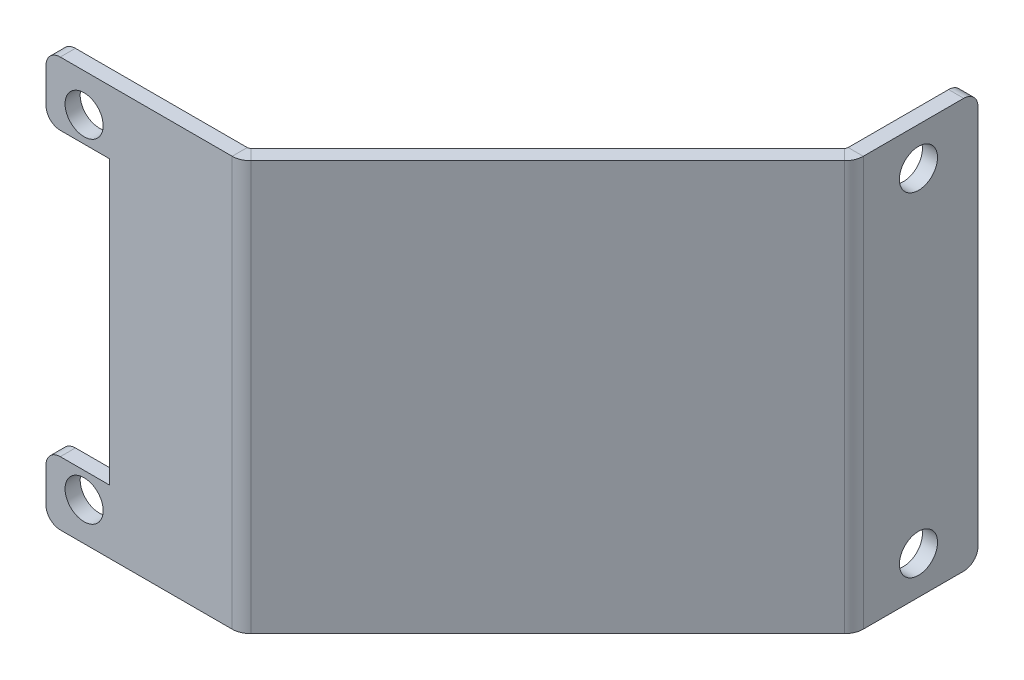
ISO-10303-21;
HEADER;
FILE_DESCRIPTION(('STEP AP214'),'2;1');
FILE_NAME('part.step','',(''),(''),'','','');
FILE_SCHEMA(('AUTOMOTIVE_DESIGN { 1 0 10303 214 1 1 1 1 }'));
ENDSEC;
DATA;
#1=APPLICATION_CONTEXT('core data for automotive mechanical design processes');
#2=APPLICATION_PROTOCOL_DEFINITION('international standard','automotive_design',2000,#1);
#3=PRODUCT_CONTEXT('',#1,'mechanical');
#4=PRODUCT('Part','Part','',(#3));
#5=PRODUCT_RELATED_PRODUCT_CATEGORY('part','',(#4));
#6=PRODUCT_DEFINITION_FORMATION('','',#4);
#7=PRODUCT_DEFINITION_CONTEXT('part definition',#1,'design');
#8=PRODUCT_DEFINITION('design','',#6,#7);
#9=PRODUCT_DEFINITION_SHAPE('','',#8);
#10=(LENGTH_UNIT() NAMED_UNIT(*) SI_UNIT(.MILLI.,.METRE.));
#11=(NAMED_UNIT(*) PLANE_ANGLE_UNIT() SI_UNIT($,.RADIAN.));
#12=(NAMED_UNIT(*) SI_UNIT($,.STERADIAN.) SOLID_ANGLE_UNIT());
#13=UNCERTAINTY_MEASURE_WITH_UNIT(LENGTH_MEASURE(1.E-05),#10,'distance_accuracy_value','');
#14=(GEOMETRIC_REPRESENTATION_CONTEXT(3) GLOBAL_UNCERTAINTY_ASSIGNED_CONTEXT((#13)) GLOBAL_UNIT_ASSIGNED_CONTEXT((#10,
#11,#12)) REPRESENTATION_CONTEXT('',''));
#15=CARTESIAN_POINT('',(0.,0.,0.));
#16=DIRECTION('',(0.,0.,1.));
#17=DIRECTION('',(1.,0.,0.));
#18=AXIS2_PLACEMENT_3D('',#15,#16,#17);
#19=CARTESIAN_POINT('',(-25.1524992584834,0.,-64.1399349067142));
#20=DIRECTION('',(-0.707106781186549,0.,-0.707106781186546));
#21=DIRECTION('',(-0.707106781186546,0.,0.707106781186549));
#22=AXIS2_PLACEMENT_3D('',#19,#20,#21);
#23=PLANE('',#22);
#24=DIRECTION('',(-0.707106781186546,0.,0.707106781186549));
#25=VECTOR('',#24,1.);
#26=CARTESIAN_POINT('',(-7.47482972881975,86.,-81.817604436378));
#27=LINE('',#26,#25);
#28=CARTESIAN_POINT('',(-25.7978557732693,86.,-63.4945783919284));
#29=VERTEX_POINT('',#28);
#30=CARTESIAN_POINT('',(-88.1467530504867,86.0000000000001,-1.14568111471071));
#31=VERTEX_POINT('',#30);
#32=EDGE_CURVE('E354',#29,#31,#27,.T.);
#33=ORIENTED_EDGE('',*,*,#32,.T.);
#34=DIRECTION('',(0.,-1.,0.));
#35=VECTOR('',#34,1.);
#36=CARTESIAN_POINT('',(-88.1467530504867,0.,-1.14568111471072));
#37=LINE('',#36,#35);
#38=CARTESIAN_POINT('',(-88.1467530504867,0.,-1.14568111471072));
#39=VERTEX_POINT('',#38);
#40=EDGE_CURVE('E423',#31,#39,#37,.T.);
#41=ORIENTED_EDGE('',*,*,#40,.T.);
#42=DIRECTION('',(-0.707106781186546,0.,0.707106781186549));
#43=VECTOR('',#42,1.);
#44=CARTESIAN_POINT('',(-25.1524992584834,0.,-64.1399349067142));
#45=LINE('',#44,#43);
#46=CARTESIAN_POINT('',(-25.7978557732693,0.,-63.4945783919284));
#47=VERTEX_POINT('',#46);
#48=EDGE_CURVE('E437',#47,#39,#45,.T.);
#49=ORIENTED_EDGE('',*,*,#48,.F.);
#50=DIRECTION('',(0.,-1.,0.));
#51=VECTOR('',#50,1.);
#52=CARTESIAN_POINT('',(-25.7978557732693,0.,-63.4945783919284));
#53=LINE('',#52,#51);
#54=EDGE_CURVE('E342',#29,#47,#53,.T.);
#55=ORIENTED_EDGE('',*,*,#54,.F.);
#56=EDGE_LOOP('',(#33,#41,#49,#55));
#57=FACE_BOUND('',#56,.T.);
#58=ADVANCED_FACE('F55',(#57),#23,.F.);
#59=CARTESIAN_POINT('',(-27.3975632887507,0.,-66.3849989369815));
#60=DIRECTION('',(0.,1.,0.));
#61=DIRECTION('',(-0.707106781186546,0.,0.707106781186549));
#62=AXIS2_PLACEMENT_3D('',#59,#60,#61);
#63=PLANE('',#62);
#64=ORIENTED_EDGE('',*,*,#48,.T.);
#65=DIRECTION('',(-0.707106781186549,0.,-0.707106781186546));
#66=VECTOR('',#65,1.);
#67=CARTESIAN_POINT('',(-90.391817080754,0.,-3.39074514497801));
#68=LINE('',#67,#66);
#69=CARTESIAN_POINT('',(-90.391817080754,0.,-3.39074514497798));
#70=VERTEX_POINT('',#69);
#71=EDGE_CURVE('E420',#39,#70,#68,.T.);
#72=ORIENTED_EDGE('',*,*,#71,.T.);
#73=DIRECTION('',(-0.707106781186546,0.,0.707106781186549));
#74=VECTOR('',#73,1.);
#75=CARTESIAN_POINT('',(-9.71989375908704,0.,-84.0626684666452));
#76=LINE('',#75,#74);
#77=CARTESIAN_POINT('',(-28.0429198035366,0.,-65.7396424221957));
#78=VERTEX_POINT('',#77);
#79=EDGE_CURVE('E359',#78,#70,#76,.T.);
#80=ORIENTED_EDGE('',*,*,#79,.F.);
#81=DIRECTION('',(-0.707106781186549,0.,-0.707106781186546));
#82=VECTOR('',#81,1.);
#83=CARTESIAN_POINT('',(-28.0429198035366,0.,-65.7396424221957));
#84=LINE('',#83,#82);
#85=EDGE_CURVE('E360',#47,#78,#84,.T.);
#86=ORIENTED_EDGE('',*,*,#85,.F.);
#87=EDGE_LOOP('',(#64,#72,#80,#86));
#88=FACE_BOUND('',#87,.T.);
#89=ADVANCED_FACE('F548',(#88),#63,.F.);
#90=CARTESIAN_POINT('',(-27.8271746585586,0.,-65.3478253414417));
#91=DIRECTION('',(0.,1.,0.));
#92=DIRECTION('',(0.,0.,1.));
#93=AXIS2_PLACEMENT_3D('',#90,#91,#92);
#94=PLANE('',#93);
#95=DIRECTION('',(0.,0.,1.));
#96=VECTOR('',#95,1.);
#97=CARTESIAN_POINT('',(-27.8271746585587,0.,-90.3478253414417));
#98=LINE('',#97,#96);
#99=CARTESIAN_POINT('',(-27.8271746585587,0.,-87.3478253414417));
#100=VERTEX_POINT('',#99);
#101=CARTESIAN_POINT('',(-27.8271746585586,0.,-66.2604972772177));
#102=VERTEX_POINT('',#101);
#103=EDGE_CURVE('E387',#100,#102,#98,.T.);
#104=ORIENTED_EDGE('',*,*,#103,.F.);
#105=DIRECTION('',(1.,0.,0.));
#106=VECTOR('',#105,1.);
#107=CARTESIAN_POINT('',(-27.8271746585587,0.,-87.3478253414417));
#108=LINE('',#107,#106);
#109=CARTESIAN_POINT('',(-24.6521746585587,0.,-87.3478253414417));
#110=VERTEX_POINT('',#109);
#111=EDGE_CURVE('E506',#100,#110,#108,.T.);
#112=ORIENTED_EDGE('',*,*,#111,.T.);
#113=DIRECTION('',(0.,0.,1.));
#114=VECTOR('',#113,1.);
#115=CARTESIAN_POINT('',(-24.6521746585586,0.,-65.3478253414417));
#116=LINE('',#115,#114);
#117=CARTESIAN_POINT('',(-24.6521746585586,0.,-66.2604972772177));
#118=VERTEX_POINT('',#117);
#119=EDGE_CURVE('E392',#110,#118,#116,.T.);
#120=ORIENTED_EDGE('',*,*,#119,.T.);
#121=DIRECTION('',(-1.,0.,0.));
#122=VECTOR('',#121,1.);
#123=CARTESIAN_POINT('',(-27.8271746585586,0.,-66.2604972772177));
#124=LINE('',#123,#122);
#125=EDGE_CURVE('E397',#118,#102,#124,.T.);
#126=ORIENTED_EDGE('',*,*,#125,.T.);
#127=EDGE_LOOP('',(#104,#112,#120,#126));
#128=FACE_BOUND('',#127,.T.);
#129=ADVANCED_FACE('F578',(#128),#94,.F.);
#130=CARTESIAN_POINT('',(-24.6521746585586,0.,-65.3478253414417));
#131=DIRECTION('',(-1.,0.,0.));
#132=DIRECTION('',(0.,0.,1.));
#133=AXIS2_PLACEMENT_3D('',#130,#131,#132);
#134=PLANE('',#133);
#135=CARTESIAN_POINT('',(-24.6521746585586,8.00000000000001,-77.8478253414417));
#136=DIRECTION('',(1.,0.,0.));
#137=DIRECTION('',(0.,0.,-1.));
#138=AXIS2_PLACEMENT_3D('',#135,#136,#137);
#139=CIRCLE('',#138,4.);
#140=CARTESIAN_POINT('',(-24.6521746585586,8.00000000000001,-81.8478253414417));
#141=VERTEX_POINT('',#140);
#142=EDGE_CURVE('E371',#141,#141,#139,.T.);
#143=ORIENTED_EDGE('',*,*,#142,.F.);
#144=EDGE_LOOP('',(#143));
#145=FACE_BOUND('',#144,.T.);
#146=CARTESIAN_POINT('',(-24.6521746585586,78.,-77.8478253414417));
#147=DIRECTION('',(1.,0.,0.));
#148=DIRECTION('',(0.,0.,-1.));
#149=AXIS2_PLACEMENT_3D('',#146,#147,#148);
#150=CIRCLE('',#149,4.);
#151=CARTESIAN_POINT('',(-24.6521746585586,78.,-81.8478253414417));
#152=VERTEX_POINT('',#151);
#153=EDGE_CURVE('E372',#152,#152,#150,.T.);
#154=ORIENTED_EDGE('',*,*,#153,.F.);
#155=EDGE_LOOP('',(#154));
#156=FACE_BOUND('',#155,.T.);
#157=DIRECTION('',(0.,-1.,0.));
#158=VECTOR('',#157,1.);
#159=CARTESIAN_POINT('',(-24.6521746585587,86.,-90.3478253414417));
#160=LINE('',#159,#158);
#161=CARTESIAN_POINT('',(-24.6521746585587,83.,-90.3478253414417));
#162=VERTEX_POINT('',#161);
#163=CARTESIAN_POINT('',(-24.6521746585587,3.,-90.3478253414417));
#164=VERTEX_POINT('',#163);
#165=EDGE_CURVE('E380',#162,#164,#160,.T.);
#166=ORIENTED_EDGE('',*,*,#165,.F.);
#167=CARTESIAN_POINT('',(-24.6521746585587,83.,-87.3478253414417));
#168=DIRECTION('',(-1.,0.,0.));
#169=DIRECTION('',(0.,0.,1.));
#170=AXIS2_PLACEMENT_3D('',#167,#168,#169);
#171=CIRCLE('',#170,3.);
#172=CARTESIAN_POINT('',(-24.6521746585587,86.,-87.3478253414417));
#173=VERTEX_POINT('',#172);
#174=EDGE_CURVE('E496',#162,#173,#171,.F.);
#175=ORIENTED_EDGE('',*,*,#174,.T.);
#176=DIRECTION('',(0.,0.,1.));
#177=VECTOR('',#176,1.);
#178=CARTESIAN_POINT('',(-24.6521746585587,86.,-90.3478253414417));
#179=LINE('',#178,#177);
#180=CARTESIAN_POINT('',(-24.6521746585586,86.,-66.2604972772177));
#181=VERTEX_POINT('',#180);
#182=EDGE_CURVE('E388',#173,#181,#179,.T.);
#183=ORIENTED_EDGE('',*,*,#182,.T.);
#184=DIRECTION('',(0.,-1.,0.));
#185=VECTOR('',#184,1.);
#186=CARTESIAN_POINT('',(-24.6521746585586,0.,-66.2604972772177));
#187=LINE('',#186,#185);
#188=EDGE_CURVE('E402',#181,#118,#187,.T.);
#189=ORIENTED_EDGE('',*,*,#188,.T.);
#190=ORIENTED_EDGE('',*,*,#119,.F.);
#191=CARTESIAN_POINT('',(-24.6521746585587,3.,-87.3478253414417));
#192=DIRECTION('',(-1.,0.,0.));
#193=DIRECTION('',(0.,0.,1.));
#194=AXIS2_PLACEMENT_3D('',#191,#192,#193);
#195=CIRCLE('',#194,3.);
#196=EDGE_CURVE('E493',#110,#164,#195,.F.);
#197=ORIENTED_EDGE('',*,*,#196,.T.);
#198=EDGE_LOOP('',(#166,#175,#183,#189,#190,#197));
#199=FACE_BOUND('',#198,.T.);
#200=ADVANCED_FACE('F576',(#145,#156,#199),#134,.F.);
#201=CARTESIAN_POINT('',(-27.8271746585586,0.,-65.3478253414417));
#202=DIRECTION('',(-1.,0.,0.));
#203=DIRECTION('',(0.,0.,1.));
#204=AXIS2_PLACEMENT_3D('',#201,#202,#203);
#205=PLANE('',#204);
#206=DIRECTION('',(0.,0.,1.));
#207=VECTOR('',#206,1.);
#208=CARTESIAN_POINT('',(-27.8271746585586,86.,-65.3478253414417));
#209=LINE('',#208,#207);
#210=CARTESIAN_POINT('',(-27.8271746585587,86.,-87.3478253414417));
#211=VERTEX_POINT('',#210);
#212=CARTESIAN_POINT('',(-27.8271746585586,86.,-66.2604972772177));
#213=VERTEX_POINT('',#212);
#214=EDGE_CURVE('E398',#211,#213,#209,.T.);
#215=ORIENTED_EDGE('',*,*,#214,.F.);
#216=CARTESIAN_POINT('',(-27.8271746585587,83.,-87.3478253414417));
#217=DIRECTION('',(-1.,0.,0.));
#218=DIRECTION('',(0.,0.,1.));
#219=AXIS2_PLACEMENT_3D('',#216,#217,#218);
#220=CIRCLE('',#219,3.);
#221=CARTESIAN_POINT('',(-27.8271746585587,83.,-90.3478253414417));
#222=VERTEX_POINT('',#221);
#223=EDGE_CURVE('E503',#211,#222,#220,.T.);
#224=ORIENTED_EDGE('',*,*,#223,.T.);
#225=DIRECTION('',(0.,-1.,0.));
#226=VECTOR('',#225,1.);
#227=CARTESIAN_POINT('',(-27.8271746585587,86.,-90.3478253414417));
#228=LINE('',#227,#226);
#229=CARTESIAN_POINT('',(-27.8271746585587,3.,-90.3478253414417));
#230=VERTEX_POINT('',#229);
#231=EDGE_CURVE('E384',#222,#230,#228,.T.);
#232=ORIENTED_EDGE('',*,*,#231,.T.);
#233=CARTESIAN_POINT('',(-27.8271746585587,3.,-87.3478253414417));
#234=DIRECTION('',(-1.,0.,0.));
#235=DIRECTION('',(0.,0.,1.));
#236=AXIS2_PLACEMENT_3D('',#233,#234,#235);
#237=CIRCLE('',#236,3.);
#238=EDGE_CURVE('E71',#230,#100,#237,.T.);
#239=ORIENTED_EDGE('',*,*,#238,.T.);
#240=ORIENTED_EDGE('',*,*,#103,.T.);
#241=DIRECTION('',(0.,-1.,0.));
#242=VECTOR('',#241,1.);
#243=CARTESIAN_POINT('',(-27.8271746585586,0.,-66.2604972772177));
#244=LINE('',#243,#242);
#245=EDGE_CURVE('E393',#213,#102,#244,.T.);
#246=ORIENTED_EDGE('',*,*,#245,.F.);
#247=EDGE_LOOP('',(#215,#224,#232,#239,#240,#246));
#248=FACE_BOUND('',#247,.T.);
#249=CARTESIAN_POINT('',(-27.8271746585586,78.,-77.8478253414417));
#250=DIRECTION('',(1.,0.,0.));
#251=DIRECTION('',(0.,0.,-1.));
#252=AXIS2_PLACEMENT_3D('',#249,#250,#251);
#253=CIRCLE('',#252,4.);
#254=CARTESIAN_POINT('',(-27.8271746585586,78.,-81.8478253414417));
#255=VERTEX_POINT('',#254);
#256=EDGE_CURVE('E367',#255,#255,#253,.T.);
#257=ORIENTED_EDGE('',*,*,#256,.T.);
#258=EDGE_LOOP('',(#257));
#259=FACE_BOUND('',#258,.T.);
#260=CARTESIAN_POINT('',(-27.8271746585586,8.00000000000001,-77.8478253414417));
#261=DIRECTION('',(1.,0.,0.));
#262=DIRECTION('',(0.,0.,-1.));
#263=AXIS2_PLACEMENT_3D('',#260,#261,#262);
#264=CIRCLE('',#263,4.);
#265=CARTESIAN_POINT('',(-27.8271746585586,8.00000000000001,-81.8478253414417));
#266=VERTEX_POINT('',#265);
#267=EDGE_CURVE('E376',#266,#266,#264,.T.);
#268=ORIENTED_EDGE('',*,*,#267,.T.);
#269=EDGE_LOOP('',(#268));
#270=FACE_BOUND('',#269,.T.);
#271=ADVANCED_FACE('F561',(#248,#259,#270),#205,.T.);
#272=CARTESIAN_POINT('',(-27.8271746585587,86.,-90.3478253414417));
#273=DIRECTION('',(0.,0.,1.));
#274=DIRECTION('',(1.,0.,0.));
#275=AXIS2_PLACEMENT_3D('',#272,#273,#274);
#276=PLANE('',#275);
#277=ORIENTED_EDGE('',*,*,#231,.F.);
#278=DIRECTION('',(1.,0.,0.));
#279=VECTOR('',#278,1.);
#280=CARTESIAN_POINT('',(-24.6521746585587,83.,-90.3478253414417));
#281=LINE('',#280,#279);
#282=EDGE_CURVE('E489',#222,#162,#281,.T.);
#283=ORIENTED_EDGE('',*,*,#282,.T.);
#284=ORIENTED_EDGE('',*,*,#165,.T.);
#285=DIRECTION('',(1.,0.,0.));
#286=VECTOR('',#285,1.);
#287=CARTESIAN_POINT('',(-27.8271746585587,3.,-90.3478253414417));
#288=LINE('',#287,#286);
#289=EDGE_CURVE('E486',#164,#230,#288,.F.);
#290=ORIENTED_EDGE('',*,*,#289,.T.);
#291=EDGE_LOOP('',(#277,#283,#284,#290));
#292=FACE_BOUND('',#291,.T.);
#293=ADVANCED_FACE('F585',(#292),#276,.F.);
#294=CARTESIAN_POINT('',(-27.8271746585587,86.,-90.3478253414417));
#295=DIRECTION('',(0.,1.,0.));
#296=DIRECTION('',(0.,0.,1.));
#297=AXIS2_PLACEMENT_3D('',#294,#295,#296);
#298=PLANE('',#297);
#299=ORIENTED_EDGE('',*,*,#182,.F.);
#300=DIRECTION('',(1.,0.,0.));
#301=VECTOR('',#300,1.);
#302=CARTESIAN_POINT('',(-27.8271746585587,86.,-87.3478253414417));
#303=LINE('',#302,#301);
#304=EDGE_CURVE('E79',#173,#211,#303,.F.);
#305=ORIENTED_EDGE('',*,*,#304,.T.);
#306=ORIENTED_EDGE('',*,*,#214,.T.);
#307=DIRECTION('',(-1.,0.,0.));
#308=VECTOR('',#307,1.);
#309=CARTESIAN_POINT('',(-27.8271746585586,86.,-66.2604972772177));
#310=LINE('',#309,#308);
#311=EDGE_CURVE('E406',#181,#213,#310,.T.);
#312=ORIENTED_EDGE('',*,*,#311,.F.);
#313=EDGE_LOOP('',(#299,#305,#306,#312));
#314=FACE_BOUND('',#313,.T.);
#315=ADVANCED_FACE('F570',(#314),#298,.T.);
#316=CARTESIAN_POINT('',(-27.8271746585586,8.00000000000001,-77.8478253414417));
#317=DIRECTION('',(1.,0.,0.));
#318=DIRECTION('',(0.,0.,-1.));
#319=AXIS2_PLACEMENT_3D('',#316,#317,#318);
#320=CYLINDRICAL_SURFACE('',#319,4.);
#321=ORIENTED_EDGE('',*,*,#267,.F.);
#322=EDGE_LOOP('',(#321));
#323=FACE_BOUND('',#322,.T.);
#324=ORIENTED_EDGE('',*,*,#142,.T.);
#325=EDGE_LOOP('',(#324));
#326=FACE_BOUND('',#325,.T.);
#327=ADVANCED_FACE('F670',(#323,#326),#320,.F.);
#328=CARTESIAN_POINT('',(-27.8271746585586,78.,-77.8478253414417));
#329=DIRECTION('',(1.,0.,0.));
#330=DIRECTION('',(0.,0.,-1.));
#331=AXIS2_PLACEMENT_3D('',#328,#329,#330);
#332=CYLINDRICAL_SURFACE('',#331,4.);
#333=ORIENTED_EDGE('',*,*,#256,.F.);
#334=EDGE_LOOP('',(#333));
#335=FACE_BOUND('',#334,.T.);
#336=ORIENTED_EDGE('',*,*,#153,.T.);
#337=EDGE_LOOP('',(#336));
#338=FACE_BOUND('',#337,.T.);
#339=ADVANCED_FACE('F667',(#335,#338),#332,.F.);
#340=CARTESIAN_POINT('',(-27.3975632887507,0.,-66.3849989369815));
#341=DIRECTION('',(-0.707106781186549,0.,-0.707106781186546));
#342=DIRECTION('',(-0.707106781186546,0.,0.707106781186549));
#343=AXIS2_PLACEMENT_3D('',#340,#341,#342);
#344=PLANE('',#343);
#345=DIRECTION('',(0.,-1.,0.));
#346=VECTOR('',#345,1.);
#347=CARTESIAN_POINT('',(-90.391817080754,0.,-3.39074514497801));
#348=LINE('',#347,#346);
#349=CARTESIAN_POINT('',(-90.391817080754,86.,-3.390745144978));
#350=VERTEX_POINT('',#349);
#351=EDGE_CURVE('E249',#350,#70,#348,.T.);
#352=ORIENTED_EDGE('',*,*,#351,.F.);
#353=DIRECTION('',(-0.707106781186546,0.,0.707106781186549));
#354=VECTOR('',#353,1.);
#355=CARTESIAN_POINT('',(-27.3975632887507,86.,-66.3849989369815));
#356=LINE('',#355,#354);
#357=CARTESIAN_POINT('',(-28.0429198035366,86.,-65.7396424221957));
#358=VERTEX_POINT('',#357);
#359=EDGE_CURVE('E353',#358,#350,#356,.T.);
#360=ORIENTED_EDGE('',*,*,#359,.F.);
#361=DIRECTION('',(0.,-1.,0.));
#362=VECTOR('',#361,1.);
#363=CARTESIAN_POINT('',(-28.0429198035366,0.,-65.7396424221957));
#364=LINE('',#363,#362);
#365=EDGE_CURVE('E355',#358,#78,#364,.T.);
#366=ORIENTED_EDGE('',*,*,#365,.T.);
#367=ORIENTED_EDGE('',*,*,#79,.T.);
#368=EDGE_LOOP('',(#352,#360,#366,#367));
#369=FACE_BOUND('',#368,.T.);
#370=ADVANCED_FACE('F550',(#369),#344,.T.);
#371=CARTESIAN_POINT('',(-9.71989375908704,86.,-84.0626684666452));
#372=DIRECTION('',(0.,1.,0.));
#373=DIRECTION('',(-0.707106781186546,0.,0.707106781186549));
#374=AXIS2_PLACEMENT_3D('',#371,#372,#373);
#375=PLANE('',#374);
#376=DIRECTION('',(-0.707106781186549,0.,-0.707106781186546));
#377=VECTOR('',#376,1.);
#378=CARTESIAN_POINT('',(-90.391817080754,86.0000000000001,-3.390745144978));
#379=LINE('',#378,#377);
#380=EDGE_CURVE('E427',#31,#350,#379,.T.);
#381=ORIENTED_EDGE('',*,*,#380,.F.);
#382=ORIENTED_EDGE('',*,*,#32,.F.);
#383=DIRECTION('',(-0.707106781186549,0.,-0.707106781186546));
#384=VECTOR('',#383,1.);
#385=CARTESIAN_POINT('',(-28.0429198035366,86.,-65.7396424221957));
#386=LINE('',#385,#384);
#387=EDGE_CURVE('E349',#29,#358,#386,.T.);
#388=ORIENTED_EDGE('',*,*,#387,.T.);
#389=ORIENTED_EDGE('',*,*,#359,.T.);
#390=EDGE_LOOP('',(#381,#382,#388,#389));
#391=FACE_BOUND('',#390,.T.);
#392=ADVANCED_FACE('F607',(#391),#375,.T.);
#393=CARTESIAN_POINT('',(-28.5637746585586,86.,-66.2604972772177));
#394=DIRECTION('',(0.,-1.,0.));
#395=DIRECTION('',(-0.707106781186549,0.,-0.707106781186546));
#396=AXIS2_PLACEMENT_3D('',#393,#394,#395);
#397=PLANE('',#396);
#398=ORIENTED_EDGE('',*,*,#387,.F.);
#399=CARTESIAN_POINT('',(-28.5637746585586,86.,-66.2604972772177));
#400=DIRECTION('',(0.,-1.,0.));
#401=DIRECTION('',(-0.707106781186549,0.,-0.707106781186546));
#402=AXIS2_PLACEMENT_3D('',#399,#400,#401);
#403=CIRCLE('',#402,3.9116);
#404=EDGE_CURVE('E266',#29,#181,#403,.F.);
#405=ORIENTED_EDGE('',*,*,#404,.T.);
#406=ORIENTED_EDGE('',*,*,#311,.T.);
#407=CARTESIAN_POINT('',(-28.5637746585586,86.,-66.2604972772177));
#408=DIRECTION('',(0.,1.,0.));
#409=DIRECTION('',(-0.707106781186549,0.,-0.707106781186546));
#410=AXIS2_PLACEMENT_3D('',#407,#408,#409);
#411=CIRCLE('',#410,0.7366);
#412=EDGE_CURVE('E333',#358,#213,#411,.T.);
#413=ORIENTED_EDGE('',*,*,#412,.F.);
#414=EDGE_LOOP('',(#398,#405,#406,#413));
#415=FACE_BOUND('',#414,.T.);
#416=ADVANCED_FACE('F567',(#415),#397,.F.);
#417=CARTESIAN_POINT('',(-28.5637746585586,0.,-66.2604972772177));
#418=DIRECTION('',(0.,1.,0.));
#419=DIRECTION('',(0.707106781186549,0.,0.707106781186546));
#420=AXIS2_PLACEMENT_3D('',#417,#418,#419);
#421=PLANE('',#420);
#422=CARTESIAN_POINT('',(-28.5637746585586,0.,-66.2604972772177));
#423=DIRECTION('',(0.,-1.,0.));
#424=DIRECTION('',(-0.707106781186549,0.,-0.707106781186546));
#425=AXIS2_PLACEMENT_3D('',#422,#423,#424);
#426=CIRCLE('',#425,3.9116);
#427=EDGE_CURVE('E338',#118,#47,#426,.T.);
#428=ORIENTED_EDGE('',*,*,#427,.T.);
#429=ORIENTED_EDGE('',*,*,#85,.T.);
#430=CARTESIAN_POINT('',(-28.5637746585586,0.,-66.2604972772177));
#431=DIRECTION('',(0.,-1.,0.));
#432=DIRECTION('',(-0.707106781186549,0.,-0.707106781186546));
#433=AXIS2_PLACEMENT_3D('',#430,#431,#432);
#434=CIRCLE('',#433,0.7366);
#435=EDGE_CURVE('E337',#102,#78,#434,.T.);
#436=ORIENTED_EDGE('',*,*,#435,.F.);
#437=ORIENTED_EDGE('',*,*,#125,.F.);
#438=EDGE_LOOP('',(#428,#429,#436,#437));
#439=FACE_BOUND('',#438,.T.);
#440=ADVANCED_FACE('F556',(#439),#421,.F.);
#441=CARTESIAN_POINT('',(-28.5637746585586,129.077944360036,-66.2604972772177));
#442=DIRECTION('',(0.,-1.,0.));
#443=DIRECTION('',(-0.707106781186549,0.,-0.707106781186546));
#444=AXIS2_PLACEMENT_3D('',#441,#442,#443);
#445=CYLINDRICAL_SURFACE('',#444,0.7366);
#446=ORIENTED_EDGE('',*,*,#245,.T.);
#447=ORIENTED_EDGE('',*,*,#435,.T.);
#448=ORIENTED_EDGE('',*,*,#365,.F.);
#449=ORIENTED_EDGE('',*,*,#412,.T.);
#450=EDGE_LOOP('',(#446,#447,#448,#449));
#451=FACE_BOUND('',#450,.T.);
#452=ADVANCED_FACE('F559',(#451),#445,.F.);
#453=CARTESIAN_POINT('',(-28.5637746585586,129.077944360036,-66.2604972772177));
#454=DIRECTION('',(0.,-1.,0.));
#455=DIRECTION('',(-0.707106781186549,0.,-0.707106781186546));
#456=AXIS2_PLACEMENT_3D('',#453,#454,#455);
#457=CYLINDRICAL_SURFACE('',#456,3.9116);
#458=ORIENTED_EDGE('',*,*,#188,.F.);
#459=ORIENTED_EDGE('',*,*,#404,.F.);
#460=ORIENTED_EDGE('',*,*,#54,.T.);
#461=ORIENTED_EDGE('',*,*,#427,.F.);
#462=EDGE_LOOP('',(#458,#459,#460,#461));
#463=FACE_BOUND('',#462,.T.);
#464=ADVANCED_FACE('F572',(#463),#457,.T.);
#465=CARTESIAN_POINT('',(-130.,72.666,-3.175));
#466=DIRECTION('',(1.,0.,0.));
#467=DIRECTION('',(0.,0.,-1.));
#468=AXIS2_PLACEMENT_3D('',#465,#466,#467);
#469=PLANE('',#468);
#470=DIRECTION('',(0.,1.,0.));
#471=VECTOR('',#470,1.);
#472=CARTESIAN_POINT('',(-130.,72.666,0.));
#473=LINE('',#472,#471);
#474=CARTESIAN_POINT('',(-130.,75.666,0.));
#475=VERTEX_POINT('',#474);
#476=CARTESIAN_POINT('',(-130.,83.0000000000001,0.));
#477=VERTEX_POINT('',#476);
#478=EDGE_CURVE('E244',#475,#477,#473,.T.);
#479=ORIENTED_EDGE('',*,*,#478,.T.);
#480=DIRECTION('',(0.,0.,1.));
#481=VECTOR('',#480,1.);
#482=CARTESIAN_POINT('',(-130.,83.0000000000001,-3.175));
#483=LINE('',#482,#481);
#484=CARTESIAN_POINT('',(-130.,83.0000000000001,-3.175));
#485=VERTEX_POINT('',#484);
#486=EDGE_CURVE('E462',#477,#485,#483,.F.);
#487=ORIENTED_EDGE('',*,*,#486,.T.);
#488=DIRECTION('',(0.,1.,0.));
#489=VECTOR('',#488,1.);
#490=CARTESIAN_POINT('',(-130.,72.666,-3.175));
#491=LINE('',#490,#489);
#492=CARTESIAN_POINT('',(-130.,75.666,-3.175));
#493=VERTEX_POINT('',#492);
#494=EDGE_CURVE('E288',#493,#485,#491,.T.);
#495=ORIENTED_EDGE('',*,*,#494,.F.);
#496=DIRECTION('',(0.,0.,1.));
#497=VECTOR('',#496,1.);
#498=CARTESIAN_POINT('',(-130.,75.666,0.));
#499=LINE('',#498,#497);
#500=EDGE_CURVE('E458',#493,#475,#499,.T.);
#501=ORIENTED_EDGE('',*,*,#500,.T.);
#502=EDGE_LOOP('',(#479,#487,#495,#501));
#503=FACE_BOUND('',#502,.T.);
#504=ADVANCED_FACE('F524',(#503),#469,.F.);
#505=CARTESIAN_POINT('',(-130.,72.666,-3.175));
#506=DIRECTION('',(0.,-1.,0.));
#507=DIRECTION('',(0.,0.,-1.));
#508=AXIS2_PLACEMENT_3D('',#505,#506,#507);
#509=PLANE('',#508);
#510=DIRECTION('',(1.,0.,0.));
#511=VECTOR('',#510,1.);
#512=CARTESIAN_POINT('',(-130.,72.666,0.));
#513=LINE('',#512,#511);
#514=CARTESIAN_POINT('',(-127.,72.666,0.));
#515=VERTEX_POINT('',#514);
#516=CARTESIAN_POINT('',(-116.7,72.666,0.));
#517=VERTEX_POINT('',#516);
#518=EDGE_CURVE('E278',#515,#517,#513,.T.);
#519=ORIENTED_EDGE('',*,*,#518,.F.);
#520=DIRECTION('',(0.,0.,1.));
#521=VECTOR('',#520,1.);
#522=CARTESIAN_POINT('',(-127.,72.666,-3.175));
#523=LINE('',#522,#521);
#524=CARTESIAN_POINT('',(-127.,72.666,-3.175));
#525=VERTEX_POINT('',#524);
#526=EDGE_CURVE('E64',#515,#525,#523,.F.);
#527=ORIENTED_EDGE('',*,*,#526,.T.);
#528=DIRECTION('',(1.,0.,0.));
#529=VECTOR('',#528,1.);
#530=CARTESIAN_POINT('',(-130.,72.666,-3.175));
#531=LINE('',#530,#529);
#532=CARTESIAN_POINT('',(-116.7,72.666,-3.175));
#533=VERTEX_POINT('',#532);
#534=EDGE_CURVE('E327',#525,#533,#531,.T.);
#535=ORIENTED_EDGE('',*,*,#534,.T.);
#536=DIRECTION('',(0.,0.,1.));
#537=VECTOR('',#536,1.);
#538=CARTESIAN_POINT('',(-116.7,72.666,-3.175));
#539=LINE('',#538,#537);
#540=EDGE_CURVE('E323',#533,#517,#539,.T.);
#541=ORIENTED_EDGE('',*,*,#540,.T.);
#542=EDGE_LOOP('',(#519,#527,#535,#541));
#543=FACE_BOUND('',#542,.T.);
#544=ADVANCED_FACE('F514',(#543),#509,.T.);
#545=CARTESIAN_POINT('',(-116.7,72.666,-3.175));
#546=DIRECTION('',(-1.,0.,0.));
#547=DIRECTION('',(0.,0.,1.));
#548=AXIS2_PLACEMENT_3D('',#545,#546,#547);
#549=PLANE('',#548);
#550=DIRECTION('',(0.,-1.,0.));
#551=VECTOR('',#550,1.);
#552=CARTESIAN_POINT('',(-116.7,72.666,0.));
#553=LINE('',#552,#551);
#554=CARTESIAN_POINT('',(-116.7,13.334,0.));
#555=VERTEX_POINT('',#554);
#556=EDGE_CURVE('E274',#517,#555,#553,.T.);
#557=ORIENTED_EDGE('',*,*,#556,.F.);
#558=ORIENTED_EDGE('',*,*,#540,.F.);
#559=DIRECTION('',(0.,-1.,0.));
#560=VECTOR('',#559,1.);
#561=CARTESIAN_POINT('',(-116.7,72.666,-3.175));
#562=LINE('',#561,#560);
#563=CARTESIAN_POINT('',(-116.7,13.334,-3.175));
#564=VERTEX_POINT('',#563);
#565=EDGE_CURVE('E319',#533,#564,#562,.T.);
#566=ORIENTED_EDGE('',*,*,#565,.T.);
#567=DIRECTION('',(0.,0.,1.));
#568=VECTOR('',#567,1.);
#569=CARTESIAN_POINT('',(-116.7,13.334,-3.175));
#570=LINE('',#569,#568);
#571=EDGE_CURVE('E315',#564,#555,#570,.T.);
#572=ORIENTED_EDGE('',*,*,#571,.T.);
#573=EDGE_LOOP('',(#557,#558,#566,#572));
#574=FACE_BOUND('',#573,.T.);
#575=ADVANCED_FACE('F631',(#574),#549,.T.);
#576=CARTESIAN_POINT('',(-130.,13.334,-3.175));
#577=DIRECTION('',(0.,-1.,0.));
#578=DIRECTION('',(0.,0.,-1.));
#579=AXIS2_PLACEMENT_3D('',#576,#577,#578);
#580=PLANE('',#579);
#581=DIRECTION('',(1.,0.,0.));
#582=VECTOR('',#581,1.);
#583=CARTESIAN_POINT('',(-130.,13.334,-3.175));
#584=LINE('',#583,#582);
#585=CARTESIAN_POINT('',(-127.,13.334,-3.175));
#586=VERTEX_POINT('',#585);
#587=EDGE_CURVE('E291',#586,#564,#584,.T.);
#588=ORIENTED_EDGE('',*,*,#587,.F.);
#589=DIRECTION('',(0.,0.,1.));
#590=VECTOR('',#589,1.);
#591=CARTESIAN_POINT('',(-127.,13.334,-3.175));
#592=LINE('',#591,#590);
#593=CARTESIAN_POINT('',(-127.,13.334,0.));
#594=VERTEX_POINT('',#593);
#595=EDGE_CURVE('E12',#586,#594,#592,.T.);
#596=ORIENTED_EDGE('',*,*,#595,.T.);
#597=DIRECTION('',(1.,0.,0.));
#598=VECTOR('',#597,1.);
#599=CARTESIAN_POINT('',(-130.,13.334,0.));
#600=LINE('',#599,#598);
#601=EDGE_CURVE('E312',#594,#555,#600,.T.);
#602=ORIENTED_EDGE('',*,*,#601,.T.);
#603=ORIENTED_EDGE('',*,*,#571,.F.);
#604=EDGE_LOOP('',(#588,#596,#602,#603));
#605=FACE_BOUND('',#604,.T.);
#606=ADVANCED_FACE('F634',(#605),#580,.F.);
#607=CARTESIAN_POINT('',(-130.,0.,-3.175));
#608=DIRECTION('',(1.,0.,0.));
#609=DIRECTION('',(0.,0.,-1.));
#610=AXIS2_PLACEMENT_3D('',#607,#608,#609);
#611=PLANE('',#610);
#612=DIRECTION('',(0.,1.,0.));
#613=VECTOR('',#612,1.);
#614=CARTESIAN_POINT('',(-130.,0.,-3.175));
#615=LINE('',#614,#613);
#616=CARTESIAN_POINT('',(-130.,2.99999999999999,-3.175));
#617=VERTEX_POINT('',#616);
#618=CARTESIAN_POINT('',(-130.,10.334,-3.175));
#619=VERTEX_POINT('',#618);
#620=EDGE_CURVE('E219',#617,#619,#615,.T.);
#621=ORIENTED_EDGE('',*,*,#620,.F.);
#622=DIRECTION('',(0.,0.,1.));
#623=VECTOR('',#622,1.);
#624=CARTESIAN_POINT('',(-130.,2.99999999999999,-3.175));
#625=LINE('',#624,#623);
#626=CARTESIAN_POINT('',(-130.,2.99999999999999,0.));
#627=VERTEX_POINT('',#626);
#628=EDGE_CURVE('E480',#617,#627,#625,.T.);
#629=ORIENTED_EDGE('',*,*,#628,.T.);
#630=DIRECTION('',(0.,1.,0.));
#631=VECTOR('',#630,1.);
#632=CARTESIAN_POINT('',(-130.,0.,0.));
#633=LINE('',#632,#631);
#634=CARTESIAN_POINT('',(-130.,10.334,0.));
#635=VERTEX_POINT('',#634);
#636=EDGE_CURVE('E308',#627,#635,#633,.T.);
#637=ORIENTED_EDGE('',*,*,#636,.T.);
#638=DIRECTION('',(0.,0.,1.));
#639=VECTOR('',#638,1.);
#640=CARTESIAN_POINT('',(-130.,10.334,-3.175));
#641=LINE('',#640,#639);
#642=EDGE_CURVE('E477',#635,#619,#641,.F.);
#643=ORIENTED_EDGE('',*,*,#642,.T.);
#644=EDGE_LOOP('',(#621,#629,#637,#643));
#645=FACE_BOUND('',#644,.T.);
#646=ADVANCED_FACE('F638',(#645),#611,.F.);
#647=CARTESIAN_POINT('',(-122.,78.,-3.175));
#648=DIRECTION('',(0.,0.,1.));
#649=DIRECTION('',(1.,0.,0.));
#650=AXIS2_PLACEMENT_3D('',#647,#648,#649);
#651=CYLINDRICAL_SURFACE('',#650,4.00000000000001);
#652=CARTESIAN_POINT('',(-122.,78.,-3.175));
#653=DIRECTION('',(0.,0.,1.));
#654=DIRECTION('',(1.,0.,0.));
#655=AXIS2_PLACEMENT_3D('',#652,#653,#654);
#656=CIRCLE('',#655,4.00000000000001);
#657=CARTESIAN_POINT('',(-118.,78.,-3.175));
#658=VERTEX_POINT('',#657);
#659=EDGE_CURVE('E233',#658,#658,#656,.T.);
#660=ORIENTED_EDGE('',*,*,#659,.F.);
#661=EDGE_LOOP('',(#660));
#662=FACE_BOUND('',#661,.T.);
#663=CARTESIAN_POINT('',(-122.,78.,0.));
#664=DIRECTION('',(0.,0.,1.));
#665=DIRECTION('',(1.,0.,0.));
#666=AXIS2_PLACEMENT_3D('',#663,#664,#665);
#667=CIRCLE('',#666,4.00000000000001);
#668=CARTESIAN_POINT('',(-118.,78.,0.));
#669=VERTEX_POINT('',#668);
#670=EDGE_CURVE('E304',#669,#669,#667,.T.);
#671=ORIENTED_EDGE('',*,*,#670,.T.);
#672=EDGE_LOOP('',(#671));
#673=FACE_BOUND('',#672,.T.);
#674=ADVANCED_FACE('F642',(#662,#673),#651,.F.);
#675=CARTESIAN_POINT('',(-122.,8.00000000000001,-3.175));
#676=DIRECTION('',(0.,0.,1.));
#677=DIRECTION('',(1.,0.,0.));
#678=AXIS2_PLACEMENT_3D('',#675,#676,#677);
#679=CYLINDRICAL_SURFACE('',#678,4.00000000000001);
#680=CARTESIAN_POINT('',(-122.,8.00000000000001,-3.175));
#681=DIRECTION('',(0.,0.,-1.));
#682=DIRECTION('',(-1.,0.,0.));
#683=AXIS2_PLACEMENT_3D('',#680,#681,#682);
#684=CIRCLE('',#683,4.00000000000001);
#685=CARTESIAN_POINT('',(-126.,8.00000000000001,-3.175));
#686=VERTEX_POINT('',#685);
#687=EDGE_CURVE('E300',#686,#686,#684,.T.);
#688=ORIENTED_EDGE('',*,*,#687,.T.);
#689=EDGE_LOOP('',(#688));
#690=FACE_BOUND('',#689,.T.);
#691=CARTESIAN_POINT('',(-122.,8.00000000000001,0.));
#692=DIRECTION('',(0.,0.,-1.));
#693=DIRECTION('',(-1.,0.,0.));
#694=AXIS2_PLACEMENT_3D('',#691,#692,#693);
#695=CIRCLE('',#694,4.00000000000001);
#696=CARTESIAN_POINT('',(-126.,8.00000000000001,0.));
#697=VERTEX_POINT('',#696);
#698=EDGE_CURVE('E270',#697,#697,#695,.T.);
#699=ORIENTED_EDGE('',*,*,#698,.F.);
#700=EDGE_LOOP('',(#699));
#701=FACE_BOUND('',#700,.T.);
#702=ADVANCED_FACE('F646',(#690,#701),#679,.F.);
#703=CARTESIAN_POINT('',(0.,0.,-3.175));
#704=DIRECTION('',(0.,0.,-1.));
#705=DIRECTION('',(-1.,0.,0.));
#706=AXIS2_PLACEMENT_3D('',#703,#704,#705);
#707=PLANE('',#706);
#708=ORIENTED_EDGE('',*,*,#687,.F.);
#709=EDGE_LOOP('',(#708));
#710=FACE_BOUND('',#709,.T.);
#711=ORIENTED_EDGE('',*,*,#659,.T.);
#712=EDGE_LOOP('',(#711));
#713=FACE_BOUND('',#712,.T.);
#714=ORIENTED_EDGE('',*,*,#494,.T.);
#715=CARTESIAN_POINT('',(-127.,83.0000000000001,-3.175));
#716=DIRECTION('',(0.,0.,-1.));
#717=DIRECTION('',(-1.,0.,0.));
#718=AXIS2_PLACEMENT_3D('',#715,#716,#717);
#719=CIRCLE('',#718,3.);
#720=CARTESIAN_POINT('',(-127.,86.,-3.175));
#721=VERTEX_POINT('',#720);
#722=EDGE_CURVE('E474',#485,#721,#719,.T.);
#723=ORIENTED_EDGE('',*,*,#722,.T.);
#724=DIRECTION('',(-1.,0.,0.));
#725=VECTOR('',#724,1.);
#726=CARTESIAN_POINT('',(0.,86.,-3.175));
#727=LINE('',#726,#725);
#728=CARTESIAN_POINT('',(-90.912671935776,86.,-3.175));
#729=VERTEX_POINT('',#728);
#730=EDGE_CURVE('E226',#729,#721,#727,.T.);
#731=ORIENTED_EDGE('',*,*,#730,.F.);
#732=DIRECTION('',(0.,-1.,0.));
#733=VECTOR('',#732,1.);
#734=CARTESIAN_POINT('',(-90.912671935776,0.,-3.175));
#735=LINE('',#734,#733);
#736=CARTESIAN_POINT('',(-90.912671935776,0.,-3.175));
#737=VERTEX_POINT('',#736);
#738=EDGE_CURVE('E220',#729,#737,#735,.T.);
#739=ORIENTED_EDGE('',*,*,#738,.T.);
#740=DIRECTION('',(-1.,0.,0.));
#741=VECTOR('',#740,1.);
#742=CARTESIAN_POINT('',(25.,0.,-3.175));
#743=LINE('',#742,#741);
#744=CARTESIAN_POINT('',(-127.,0.,-3.175));
#745=VERTEX_POINT('',#744);
#746=EDGE_CURVE('E207',#737,#745,#743,.T.);
#747=ORIENTED_EDGE('',*,*,#746,.T.);
#748=CARTESIAN_POINT('',(-127.,2.99999999999999,-3.175));
#749=DIRECTION('',(0.,0.,-1.));
#750=DIRECTION('',(-1.,0.,0.));
#751=AXIS2_PLACEMENT_3D('',#748,#749,#750);
#752=CIRCLE('',#751,3.);
#753=EDGE_CURVE('E471',#745,#617,#752,.T.);
#754=ORIENTED_EDGE('',*,*,#753,.T.);
#755=ORIENTED_EDGE('',*,*,#620,.T.);
#756=CARTESIAN_POINT('',(-127.,10.334,-3.175));
#757=DIRECTION('',(0.,0.,-1.));
#758=DIRECTION('',(-1.,0.,0.));
#759=AXIS2_PLACEMENT_3D('',#756,#757,#758);
#760=CIRCLE('',#759,3.);
#761=EDGE_CURVE('E465',#619,#586,#760,.T.);
#762=ORIENTED_EDGE('',*,*,#761,.T.);
#763=ORIENTED_EDGE('',*,*,#587,.T.);
#764=ORIENTED_EDGE('',*,*,#565,.F.);
#765=ORIENTED_EDGE('',*,*,#534,.F.);
#766=CARTESIAN_POINT('',(-127.,75.666,-3.175));
#767=DIRECTION('',(0.,0.,-1.));
#768=DIRECTION('',(-1.,0.,0.));
#769=AXIS2_PLACEMENT_3D('',#766,#767,#768);
#770=CIRCLE('',#769,3.);
#771=EDGE_CURVE('E468',#525,#493,#770,.T.);
#772=ORIENTED_EDGE('',*,*,#771,.T.);
#773=EDGE_LOOP('',(#714,#723,#731,#739,#747,#754,#755,#762,#763,#764,#765,#772));
#774=FACE_BOUND('',#773,.T.);
#775=ADVANCED_FACE('F224',(#710,#713,#774),#707,.T.);
#776=CARTESIAN_POINT('',(0.,0.,-3.175));
#777=DIRECTION('',(0.,1.,0.));
#778=DIRECTION('',(-1.,0.,0.));
#779=AXIS2_PLACEMENT_3D('',#776,#777,#778);
#780=PLANE('',#779);
#781=DIRECTION('',(-1.,0.,0.));
#782=VECTOR('',#781,1.);
#783=CARTESIAN_POINT('',(0.,0.,0.));
#784=LINE('',#783,#782);
#785=CARTESIAN_POINT('',(-90.912671935776,0.,0.));
#786=VERTEX_POINT('',#785);
#787=CARTESIAN_POINT('',(-127.,0.,0.));
#788=VERTEX_POINT('',#787);
#789=EDGE_CURVE('E285',#786,#788,#784,.T.);
#790=ORIENTED_EDGE('',*,*,#789,.T.);
#791=DIRECTION('',(0.,0.,1.));
#792=VECTOR('',#791,1.);
#793=CARTESIAN_POINT('',(-127.,0.,-3.175));
#794=LINE('',#793,#792);
#795=EDGE_CURVE('E215',#788,#745,#794,.F.);
#796=ORIENTED_EDGE('',*,*,#795,.T.);
#797=ORIENTED_EDGE('',*,*,#746,.F.);
#798=DIRECTION('',(0.,0.,-1.));
#799=VECTOR('',#798,1.);
#800=CARTESIAN_POINT('',(-90.912671935776,0.,-3.175));
#801=LINE('',#800,#799);
#802=EDGE_CURVE('E212',#786,#737,#801,.T.);
#803=ORIENTED_EDGE('',*,*,#802,.F.);
#804=EDGE_LOOP('',(#790,#796,#797,#803));
#805=FACE_BOUND('',#804,.T.);
#806=ADVANCED_FACE('F210',(#805),#780,.F.);
#807=CARTESIAN_POINT('',(0.,0.,0.));
#808=DIRECTION('',(0.,0.,-1.));
#809=DIRECTION('',(-1.,0.,0.));
#810=AXIS2_PLACEMENT_3D('',#807,#808,#809);
#811=PLANE('',#810);
#812=DIRECTION('',(-1.,0.,0.));
#813=VECTOR('',#812,1.);
#814=CARTESIAN_POINT('',(25.,86.,0.));
#815=LINE('',#814,#813);
#816=CARTESIAN_POINT('',(-90.912671935776,86.0000000000001,0.));
#817=VERTEX_POINT('',#816);
#818=CARTESIAN_POINT('',(-127.,86.0000000000001,0.));
#819=VERTEX_POINT('',#818);
#820=EDGE_CURVE('E281',#817,#819,#815,.T.);
#821=ORIENTED_EDGE('',*,*,#820,.T.);
#822=CARTESIAN_POINT('',(-127.,83.0000000000001,0.));
#823=DIRECTION('',(0.,0.,-1.));
#824=DIRECTION('',(-1.,0.,0.));
#825=AXIS2_PLACEMENT_3D('',#822,#823,#824);
#826=CIRCLE('',#825,3.);
#827=EDGE_CURVE('E455',#819,#477,#826,.F.);
#828=ORIENTED_EDGE('',*,*,#827,.T.);
#829=ORIENTED_EDGE('',*,*,#478,.F.);
#830=CARTESIAN_POINT('',(-127.,75.666,0.));
#831=DIRECTION('',(0.,0.,-1.));
#832=DIRECTION('',(-1.,0.,0.));
#833=AXIS2_PLACEMENT_3D('',#830,#831,#832);
#834=CIRCLE('',#833,3.);
#835=EDGE_CURVE('E449',#475,#515,#834,.F.);
#836=ORIENTED_EDGE('',*,*,#835,.T.);
#837=ORIENTED_EDGE('',*,*,#518,.T.);
#838=ORIENTED_EDGE('',*,*,#556,.T.);
#839=ORIENTED_EDGE('',*,*,#601,.F.);
#840=CARTESIAN_POINT('',(-127.,10.334,0.));
#841=DIRECTION('',(0.,0.,-1.));
#842=DIRECTION('',(-1.,0.,0.));
#843=AXIS2_PLACEMENT_3D('',#840,#841,#842);
#844=CIRCLE('',#843,3.);
#845=EDGE_CURVE('E446',#594,#635,#844,.F.);
#846=ORIENTED_EDGE('',*,*,#845,.T.);
#847=ORIENTED_EDGE('',*,*,#636,.F.);
#848=CARTESIAN_POINT('',(-127.,2.99999999999999,0.));
#849=DIRECTION('',(0.,0.,-1.));
#850=DIRECTION('',(-1.,0.,0.));
#851=AXIS2_PLACEMENT_3D('',#848,#849,#850);
#852=CIRCLE('',#851,3.);
#853=EDGE_CURVE('E452',#627,#788,#852,.F.);
#854=ORIENTED_EDGE('',*,*,#853,.T.);
#855=ORIENTED_EDGE('',*,*,#789,.F.);
#856=DIRECTION('',(0.,-1.,0.));
#857=VECTOR('',#856,1.);
#858=CARTESIAN_POINT('',(-90.912671935776,0.,0.));
#859=LINE('',#858,#857);
#860=EDGE_CURVE('E245',#817,#786,#859,.T.);
#861=ORIENTED_EDGE('',*,*,#860,.F.);
#862=EDGE_LOOP('',(#821,#828,#829,#836,#837,#838,#839,#846,#847,#854,#855,#861));
#863=FACE_BOUND('',#862,.T.);
#864=ORIENTED_EDGE('',*,*,#670,.F.);
#865=EDGE_LOOP('',(#864));
#866=FACE_BOUND('',#865,.T.);
#867=ORIENTED_EDGE('',*,*,#698,.T.);
#868=EDGE_LOOP('',(#867));
#869=FACE_BOUND('',#868,.T.);
#870=ADVANCED_FACE('F527',(#863,#866,#869),#811,.F.);
#871=CARTESIAN_POINT('',(25.,86.,-3.175));
#872=DIRECTION('',(0.,1.,0.));
#873=DIRECTION('',(-1.,0.,0.));
#874=AXIS2_PLACEMENT_3D('',#871,#872,#873);
#875=PLANE('',#874);
#876=ORIENTED_EDGE('',*,*,#730,.T.);
#877=DIRECTION('',(0.,0.,1.));
#878=VECTOR('',#877,1.);
#879=CARTESIAN_POINT('',(-127.,86.0000000000001,0.));
#880=LINE('',#879,#878);
#881=EDGE_CURVE('E431',#721,#819,#880,.T.);
#882=ORIENTED_EDGE('',*,*,#881,.T.);
#883=ORIENTED_EDGE('',*,*,#820,.F.);
#884=DIRECTION('',(0.,0.,-1.));
#885=VECTOR('',#884,1.);
#886=CARTESIAN_POINT('',(-90.912671935776,86.0000000000001,-3.175));
#887=LINE('',#886,#885);
#888=EDGE_CURVE('E267',#817,#729,#887,.T.);
#889=ORIENTED_EDGE('',*,*,#888,.T.);
#890=EDGE_LOOP('',(#876,#882,#883,#889));
#891=FACE_BOUND('',#890,.T.);
#892=ADVANCED_FACE('F535',(#891),#875,.T.);
#893=CARTESIAN_POINT('',(-90.912671935776,86.,-3.9116));
#894=DIRECTION('',(0.,-1.,0.));
#895=DIRECTION('',(0.,0.,-1.));
#896=AXIS2_PLACEMENT_3D('',#893,#894,#895);
#897=PLANE('',#896);
#898=ORIENTED_EDGE('',*,*,#888,.F.);
#899=CARTESIAN_POINT('',(-90.912671935776,86.,-3.9116));
#900=DIRECTION('',(0.,-1.,0.));
#901=DIRECTION('',(0.,0.,-1.));
#902=AXIS2_PLACEMENT_3D('',#899,#900,#901);
#903=CIRCLE('',#902,3.9116);
#904=EDGE_CURVE('E258',#817,#31,#903,.F.);
#905=ORIENTED_EDGE('',*,*,#904,.T.);
#906=ORIENTED_EDGE('',*,*,#380,.T.);
#907=CARTESIAN_POINT('',(-90.912671935776,86.,-3.9116));
#908=DIRECTION('',(0.,1.,0.));
#909=DIRECTION('',(0.,0.,-1.));
#910=AXIS2_PLACEMENT_3D('',#907,#908,#909);
#911=CIRCLE('',#910,0.736599999999998);
#912=EDGE_CURVE('E251',#729,#350,#911,.T.);
#913=ORIENTED_EDGE('',*,*,#912,.F.);
#914=EDGE_LOOP('',(#898,#905,#906,#913));
#915=FACE_BOUND('',#914,.T.);
#916=ADVANCED_FACE('F539',(#915),#897,.F.);
#917=CARTESIAN_POINT('',(-90.912671935776,0.,-3.9116));
#918=DIRECTION('',(0.,1.,0.));
#919=DIRECTION('',(0.,0.,1.));
#920=AXIS2_PLACEMENT_3D('',#917,#918,#919);
#921=PLANE('',#920);
#922=CARTESIAN_POINT('',(-90.912671935776,0.,-3.9116));
#923=DIRECTION('',(0.,-1.,0.));
#924=DIRECTION('',(0.,0.,-1.));
#925=AXIS2_PLACEMENT_3D('',#922,#923,#924);
#926=CIRCLE('',#925,3.9116);
#927=EDGE_CURVE('E242',#39,#786,#926,.T.);
#928=ORIENTED_EDGE('',*,*,#927,.T.);
#929=ORIENTED_EDGE('',*,*,#802,.T.);
#930=CARTESIAN_POINT('',(-90.912671935776,0.,-3.9116));
#931=DIRECTION('',(0.,-1.,0.));
#932=DIRECTION('',(0.,0.,-1.));
#933=AXIS2_PLACEMENT_3D('',#930,#931,#932);
#934=CIRCLE('',#933,0.736599999999998);
#935=EDGE_CURVE('E240',#70,#737,#934,.T.);
#936=ORIENTED_EDGE('',*,*,#935,.F.);
#937=ORIENTED_EDGE('',*,*,#71,.F.);
#938=EDGE_LOOP('',(#928,#929,#936,#937));
#939=FACE_BOUND('',#938,.T.);
#940=ADVANCED_FACE('F238',(#939),#921,.F.);
#941=CARTESIAN_POINT('',(-90.912671935776,129.077944360036,-3.9116));
#942=DIRECTION('',(0.,-1.,0.));
#943=DIRECTION('',(0.,0.,-1.));
#944=AXIS2_PLACEMENT_3D('',#941,#942,#943);
#945=CYLINDRICAL_SURFACE('',#944,0.7366);
#946=ORIENTED_EDGE('',*,*,#351,.T.);
#947=ORIENTED_EDGE('',*,*,#935,.T.);
#948=ORIENTED_EDGE('',*,*,#738,.F.);
#949=ORIENTED_EDGE('',*,*,#912,.T.);
#950=EDGE_LOOP('',(#946,#947,#948,#949));
#951=FACE_BOUND('',#950,.T.);
#952=ADVANCED_FACE('F248',(#951),#945,.F.);
#953=CARTESIAN_POINT('',(-90.912671935776,129.077944360036,-3.9116));
#954=DIRECTION('',(0.,-1.,0.));
#955=DIRECTION('',(0.,0.,-1.));
#956=AXIS2_PLACEMENT_3D('',#953,#954,#955);
#957=CYLINDRICAL_SURFACE('',#956,3.9116);
#958=ORIENTED_EDGE('',*,*,#40,.F.);
#959=ORIENTED_EDGE('',*,*,#904,.F.);
#960=ORIENTED_EDGE('',*,*,#860,.T.);
#961=ORIENTED_EDGE('',*,*,#927,.F.);
#962=EDGE_LOOP('',(#958,#959,#960,#961));
#963=FACE_BOUND('',#962,.T.);
#964=ADVANCED_FACE('F542',(#963),#957,.T.);
#965=CARTESIAN_POINT('',(-127.,83.0000000000001,-3.175));
#966=DIRECTION('',(0.,0.,-1.));
#967=DIRECTION('',(-1.,0.,0.));
#968=AXIS2_PLACEMENT_3D('',#965,#966,#967);
#969=CYLINDRICAL_SURFACE('',#968,3.);
#970=ORIENTED_EDGE('',*,*,#722,.F.);
#971=ORIENTED_EDGE('',*,*,#486,.F.);
#972=ORIENTED_EDGE('',*,*,#827,.F.);
#973=ORIENTED_EDGE('',*,*,#881,.F.);
#974=EDGE_LOOP('',(#970,#971,#972,#973));
#975=FACE_BOUND('',#974,.T.);
#976=ADVANCED_FACE('F533',(#975),#969,.T.);
#977=CARTESIAN_POINT('',(-127.,2.99999999999999,-3.175));
#978=DIRECTION('',(0.,0.,1.));
#979=DIRECTION('',(1.,0.,0.));
#980=AXIS2_PLACEMENT_3D('',#977,#978,#979);
#981=CYLINDRICAL_SURFACE('',#980,3.);
#982=ORIENTED_EDGE('',*,*,#753,.F.);
#983=ORIENTED_EDGE('',*,*,#795,.F.);
#984=ORIENTED_EDGE('',*,*,#853,.F.);
#985=ORIENTED_EDGE('',*,*,#628,.F.);
#986=EDGE_LOOP('',(#982,#983,#984,#985));
#987=FACE_BOUND('',#986,.T.);
#988=ADVANCED_FACE('F590',(#987),#981,.T.);
#989=CARTESIAN_POINT('',(-27.8271746585587,83.,-87.3478253414417));
#990=DIRECTION('',(-1.,0.,0.));
#991=DIRECTION('',(0.,0.,1.));
#992=AXIS2_PLACEMENT_3D('',#989,#990,#991);
#993=CYLINDRICAL_SURFACE('',#992,3.);
#994=ORIENTED_EDGE('',*,*,#223,.F.);
#995=ORIENTED_EDGE('',*,*,#304,.F.);
#996=ORIENTED_EDGE('',*,*,#174,.F.);
#997=ORIENTED_EDGE('',*,*,#282,.F.);
#998=EDGE_LOOP('',(#994,#995,#996,#997));
#999=FACE_BOUND('',#998,.T.);
#1000=ADVANCED_FACE('F588',(#999),#993,.T.);
#1001=CARTESIAN_POINT('',(-27.8271746585587,3.,-87.3478253414417));
#1002=DIRECTION('',(1.,0.,0.));
#1003=DIRECTION('',(0.,0.,-1.));
#1004=AXIS2_PLACEMENT_3D('',#1001,#1002,#1003);
#1005=CYLINDRICAL_SURFACE('',#1004,3.);
#1006=ORIENTED_EDGE('',*,*,#238,.F.);
#1007=ORIENTED_EDGE('',*,*,#289,.F.);
#1008=ORIENTED_EDGE('',*,*,#196,.F.);
#1009=ORIENTED_EDGE('',*,*,#111,.F.);
#1010=EDGE_LOOP('',(#1006,#1007,#1008,#1009));
#1011=FACE_BOUND('',#1010,.T.);
#1012=ADVANCED_FACE('F581',(#1011),#1005,.T.);
#1013=CARTESIAN_POINT('',(-127.,75.666,-3.175));
#1014=DIRECTION('',(0.,0.,-1.));
#1015=DIRECTION('',(-1.,0.,0.));
#1016=AXIS2_PLACEMENT_3D('',#1013,#1014,#1015);
#1017=CYLINDRICAL_SURFACE('',#1016,3.);
#1018=ORIENTED_EDGE('',*,*,#771,.F.);
#1019=ORIENTED_EDGE('',*,*,#526,.F.);
#1020=ORIENTED_EDGE('',*,*,#835,.F.);
#1021=ORIENTED_EDGE('',*,*,#500,.F.);
#1022=EDGE_LOOP('',(#1018,#1019,#1020,#1021));
#1023=FACE_BOUND('',#1022,.T.);
#1024=ADVANCED_FACE('F521',(#1023),#1017,.T.);
#1025=CARTESIAN_POINT('',(-127.,10.334,-3.175));
#1026=DIRECTION('',(0.,0.,1.));
#1027=DIRECTION('',(1.,0.,0.));
#1028=AXIS2_PLACEMENT_3D('',#1025,#1026,#1027);
#1029=CYLINDRICAL_SURFACE('',#1028,3.);
#1030=ORIENTED_EDGE('',*,*,#761,.F.);
#1031=ORIENTED_EDGE('',*,*,#642,.F.);
#1032=ORIENTED_EDGE('',*,*,#845,.F.);
#1033=ORIENTED_EDGE('',*,*,#595,.F.);
#1034=EDGE_LOOP('',(#1030,#1031,#1032,#1033));
#1035=FACE_BOUND('',#1034,.T.);
#1036=ADVANCED_FACE('F57',(#1035),#1029,.T.);
#1037=CLOSED_SHELL('',(#58,#89,#129,#200,#271,#293,#315,#327,#339,#370,#392,#416,#440,#452,#464,
#504,#544,#575,#606,#646,#674,#702,#775,#806,#870,#892,#916,#940,#952,#964,#976,#988,#1000,
#1012,#1024,#1036));
#1038=MANIFOLD_SOLID_BREP('B2',#1037);
#1039=ADVANCED_BREP_SHAPE_REPRESENTATION('',(#18,#1038),#14);
#1040=SHAPE_DEFINITION_REPRESENTATION(#9,#1039);
ENDSEC;
END-ISO-10303-21;
